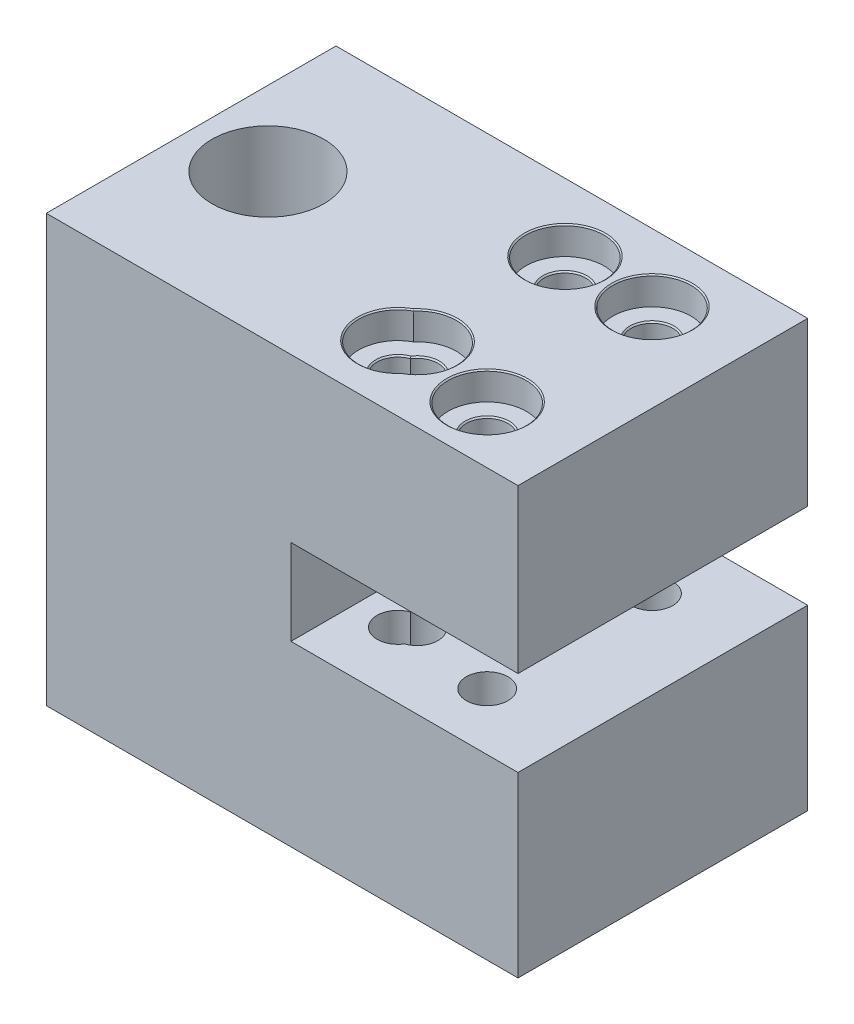
ISO-10303-21;
HEADER;
FILE_DESCRIPTION(('STEP AP214'),'2;1');
FILE_NAME('part.step','',(''),(''),'','','');
FILE_SCHEMA(('AUTOMOTIVE_DESIGN { 1 0 10303 214 1 1 1 1 }'));
ENDSEC;
DATA;
#1=APPLICATION_CONTEXT('core data for automotive mechanical design processes');
#2=APPLICATION_PROTOCOL_DEFINITION('international standard','automotive_design',2000,#1);
#3=PRODUCT_CONTEXT('',#1,'mechanical');
#4=PRODUCT('Part','Part','',(#3));
#5=PRODUCT_RELATED_PRODUCT_CATEGORY('part','',(#4));
#6=PRODUCT_DEFINITION_FORMATION('','',#4);
#7=PRODUCT_DEFINITION_CONTEXT('part definition',#1,'design');
#8=PRODUCT_DEFINITION('design','',#6,#7);
#9=PRODUCT_DEFINITION_SHAPE('','',#8);
#10=(LENGTH_UNIT() NAMED_UNIT(*) SI_UNIT(.MILLI.,.METRE.));
#11=(NAMED_UNIT(*) PLANE_ANGLE_UNIT() SI_UNIT($,.RADIAN.));
#12=(NAMED_UNIT(*) SI_UNIT($,.STERADIAN.) SOLID_ANGLE_UNIT());
#13=UNCERTAINTY_MEASURE_WITH_UNIT(LENGTH_MEASURE(1.E-05),#10,'distance_accuracy_value','');
#14=(GEOMETRIC_REPRESENTATION_CONTEXT(3) GLOBAL_UNCERTAINTY_ASSIGNED_CONTEXT((#13)) GLOBAL_UNIT_ASSIGNED_CONTEXT((#10,
#11,#12)) REPRESENTATION_CONTEXT('',''));
#15=CARTESIAN_POINT('',(0.,0.,0.));
#16=DIRECTION('',(0.,0.,1.));
#17=DIRECTION('',(1.,0.,0.));
#18=AXIS2_PLACEMENT_3D('',#15,#16,#17);
#19=CARTESIAN_POINT('',(27.3326379908102,88.3666,34.6915954341114));
#20=DIRECTION('',(0.,-1.,0.));
#21=DIRECTION('',(0.,0.,-1.));
#22=AXIS2_PLACEMENT_3D('',#19,#20,#21);
#23=PLANE('',#22);
#24=CARTESIAN_POINT('',(16.7763979908102,88.3666,34.6915954341114));
#25=DIRECTION('',(0.,1.,0.));
#26=DIRECTION('',(0.,0.,1.));
#27=AXIS2_PLACEMENT_3D('',#24,#25,#26);
#28=CIRCLE('',#27,18.65376);
#29=CARTESIAN_POINT('',(25.6803370064845,88.3666,51.0831369157034));
#30=VERTEX_POINT('',#29);
#31=CARTESIAN_POINT('',(2.75835526578295,88.3666,22.384798925803));
#32=VERTEX_POINT('',#31);
#33=EDGE_CURVE('E166',#30,#32,#28,.T.);
#34=ORIENTED_EDGE('',*,*,#33,.T.);
#35=CARTESIAN_POINT('',(11.6622942814573,88.3666,38.7763404073951));
#36=DIRECTION('',(0.,1.,0.));
#37=DIRECTION('',(0.,0.,1.));
#38=AXIS2_PLACEMENT_3D('',#35,#36,#37);
#39=CIRCLE('',#38,18.65376);
#40=EDGE_CURVE('E59',#32,#30,#39,.T.);
#41=ORIENTED_EDGE('',*,*,#40,.T.);
#42=EDGE_LOOP('',(#34,#41));
#43=FACE_BOUND('',#42,.T.);
#44=CARTESIAN_POINT('',(11.6622942814573,88.3666,38.7763404073951));
#45=DIRECTION('',(0.,1.,0.));
#46=DIRECTION('',(0.,0.,1.));
#47=AXIS2_PLACEMENT_3D('',#44,#45,#46);
#48=CIRCLE('',#47,10.55624);
#49=CARTESIAN_POINT('',(7.95592473799294,88.3666,28.8921597258778));
#50=VERTEX_POINT('',#49);
#51=CARTESIAN_POINT('',(20.4827675342745,88.3666,44.5757761156287));
#52=VERTEX_POINT('',#51);
#53=EDGE_CURVE('E11',#50,#52,#48,.T.);
#54=ORIENTED_EDGE('',*,*,#53,.F.);
#55=CARTESIAN_POINT('',(16.7763979908102,88.3666,34.6915954341114));
#56=DIRECTION('',(0.,1.,0.));
#57=DIRECTION('',(0.,0.,1.));
#58=AXIS2_PLACEMENT_3D('',#55,#56,#57);
#59=CIRCLE('',#58,10.55624);
#60=EDGE_CURVE('E161',#52,#50,#59,.T.);
#61=ORIENTED_EDGE('',*,*,#60,.F.);
#62=EDGE_LOOP('',(#54,#61));
#63=FACE_BOUND('',#62,.T.);
#64=ADVANCED_FACE('F35',(#43,#63),#23,.F.);
#65=CARTESIAN_POINT('',(100.175043425191,101.6,-68.0050091544998));
#66=DIRECTION('',(1.,0.,0.));
#67=DIRECTION('',(0.,0.,-1.));
#68=AXIS2_PLACEMENT_3D('',#65,#66,#67);
#69=PLANE('',#68);
#70=DIRECTION('',(0.,0.,1.));
#71=VECTOR('',#70,1.);
#72=CARTESIAN_POINT('',(100.175043425191,24.0369002652005,70.041087272898));
#73=LINE('',#72,#71);
#74=CARTESIAN_POINT('',(100.175043425191,24.0369002652005,-68.0050091544998));
#75=VERTEX_POINT('',#74);
#76=CARTESIAN_POINT('',(100.175043425191,24.0369002652005,70.041087272898));
#77=VERTEX_POINT('',#76);
#78=EDGE_CURVE('E185',#75,#77,#73,.T.);
#79=ORIENTED_EDGE('',*,*,#78,.F.);
#80=DIRECTION('',(0.,-1.,0.));
#81=VECTOR('',#80,1.);
#82=CARTESIAN_POINT('',(100.175043425191,101.6,-68.0050091544998));
#83=LINE('',#82,#81);
#84=CARTESIAN_POINT('',(100.175043425191,101.6,-68.0050091544998));
#85=VERTEX_POINT('',#84);
#86=EDGE_CURVE('E237',#85,#75,#83,.T.);
#87=ORIENTED_EDGE('',*,*,#86,.F.);
#88=DIRECTION('',(0.,0.,1.));
#89=VECTOR('',#88,1.);
#90=CARTESIAN_POINT('',(100.175043425191,101.6,-68.0050091544998));
#91=LINE('',#90,#89);
#92=CARTESIAN_POINT('',(100.175043425191,101.6,70.041087272898));
#93=VERTEX_POINT('',#92);
#94=EDGE_CURVE('E213',#85,#93,#91,.T.);
#95=ORIENTED_EDGE('',*,*,#94,.T.);
#96=DIRECTION('',(0.,-1.,0.));
#97=VECTOR('',#96,1.);
#98=CARTESIAN_POINT('',(100.175043425191,101.6,70.041087272898));
#99=LINE('',#98,#97);
#100=EDGE_CURVE('E44',#93,#77,#99,.T.);
#101=ORIENTED_EDGE('',*,*,#100,.T.);
#102=EDGE_LOOP('',(#79,#87,#95,#101));
#103=FACE_BOUND('',#102,.T.);
#104=ADVANCED_FACE('F420',(#103),#69,.T.);
#105=CARTESIAN_POINT('',(-124.60798084597,101.6,70.041087272898));
#106=DIRECTION('',(0.,0.,-1.));
#107=DIRECTION('',(-1.,0.,0.));
#108=AXIS2_PLACEMENT_3D('',#105,#106,#107);
#109=PLANE('',#108);
#110=DIRECTION('',(0.,-1.,0.));
#111=VECTOR('',#110,1.);
#112=CARTESIAN_POINT('',(-8.02895657480869,24.0369002652005,70.041087272898));
#113=LINE('',#112,#111);
#114=CARTESIAN_POINT('',(-8.02895657480869,24.0369002652005,70.041087272898));
#115=VERTEX_POINT('',#114);
#116=CARTESIAN_POINT('',(-8.02895657480869,-16.7804775436292,70.041087272898));
#117=VERTEX_POINT('',#116);
#118=EDGE_CURVE('E181',#115,#117,#113,.T.);
#119=ORIENTED_EDGE('',*,*,#118,.F.);
#120=DIRECTION('',(1.,0.,0.));
#121=VECTOR('',#120,1.);
#122=CARTESIAN_POINT('',(-8.02895657480869,24.0369002652005,70.041087272898));
#123=LINE('',#122,#121);
#124=EDGE_CURVE('E195',#115,#77,#123,.T.);
#125=ORIENTED_EDGE('',*,*,#124,.T.);
#126=ORIENTED_EDGE('',*,*,#100,.F.);
#127=DIRECTION('',(1.,0.,0.));
#128=VECTOR('',#127,1.);
#129=CARTESIAN_POINT('',(-124.60798084597,101.6,70.041087272898));
#130=LINE('',#129,#128);
#131=CARTESIAN_POINT('',(-124.60798084597,101.6,70.041087272898));
#132=VERTEX_POINT('',#131);
#133=EDGE_CURVE('E211',#132,#93,#130,.T.);
#134=ORIENTED_EDGE('',*,*,#133,.F.);
#135=DIRECTION('',(0.,-1.,0.));
#136=VECTOR('',#135,1.);
#137=CARTESIAN_POINT('',(-124.60798084597,101.6,70.041087272898));
#138=LINE('',#137,#136);
#139=CARTESIAN_POINT('',(-124.60798084597,-101.6,70.041087272898));
#140=VERTEX_POINT('',#139);
#141=EDGE_CURVE('E222',#132,#140,#138,.T.);
#142=ORIENTED_EDGE('',*,*,#141,.T.);
#143=DIRECTION('',(1.,0.,0.));
#144=VECTOR('',#143,1.);
#145=CARTESIAN_POINT('',(-124.60798084597,-101.6,70.041087272898));
#146=LINE('',#145,#144);
#147=CARTESIAN_POINT('',(100.175043425191,-101.6,70.041087272898));
#148=VERTEX_POINT('',#147);
#149=EDGE_CURVE('E208',#140,#148,#146,.T.);
#150=ORIENTED_EDGE('',*,*,#149,.T.);
#151=CARTESIAN_POINT('',(100.175043425191,-16.7804775436292,70.041087272898));
#152=VERTEX_POINT('',#151);
#153=EDGE_CURVE('E240',#152,#148,#99,.T.);
#154=ORIENTED_EDGE('',*,*,#153,.F.);
#155=DIRECTION('',(1.,0.,0.));
#156=VECTOR('',#155,1.);
#157=CARTESIAN_POINT('',(-8.02895657480869,-16.7804775436292,70.041087272898));
#158=LINE('',#157,#156);
#159=EDGE_CURVE('E192',#117,#152,#158,.T.);
#160=ORIENTED_EDGE('',*,*,#159,.F.);
#161=EDGE_LOOP('',(#119,#125,#126,#134,#142,#150,#154,#160));
#162=FACE_BOUND('',#161,.T.);
#163=ADVANCED_FACE('F37',(#162),#109,.F.);
#164=DIRECTION('',(0.,0.,-1.));
#165=VECTOR('',#164,1.);
#166=CARTESIAN_POINT('',(100.175043425191,-16.7804775436292,70.041087272898));
#167=LINE('',#166,#165);
#168=CARTESIAN_POINT('',(100.175043425191,-16.7804775436292,-68.0050091544998));
#169=VERTEX_POINT('',#168);
#170=EDGE_CURVE('E180',#152,#169,#167,.T.);
#171=ORIENTED_EDGE('',*,*,#170,.F.);
#172=ORIENTED_EDGE('',*,*,#153,.T.);
#173=DIRECTION('',(0.,0.,1.));
#174=VECTOR('',#173,1.);
#175=CARTESIAN_POINT('',(100.175043425191,-101.6,-68.0050091544998));
#176=LINE('',#175,#174);
#177=CARTESIAN_POINT('',(100.175043425191,-101.6,-68.0050091544998));
#178=VERTEX_POINT('',#177);
#179=EDGE_CURVE('E225',#178,#148,#176,.T.);
#180=ORIENTED_EDGE('',*,*,#179,.F.);
#181=EDGE_CURVE('E236',#169,#178,#83,.T.);
#182=ORIENTED_EDGE('',*,*,#181,.F.);
#183=EDGE_LOOP('',(#171,#172,#180,#182));
#184=FACE_BOUND('',#183,.T.);
#185=ADVANCED_FACE('F425',(#184),#69,.T.);
#186=CARTESIAN_POINT('',(-124.60798084597,101.6,-68.0050091544998));
#187=DIRECTION('',(0.,0.,-1.));
#188=DIRECTION('',(-1.,0.,0.));
#189=AXIS2_PLACEMENT_3D('',#186,#187,#188);
#190=PLANE('',#189);
#191=DIRECTION('',(1.,0.,0.));
#192=VECTOR('',#191,1.);
#193=CARTESIAN_POINT('',(-8.0289565748087,24.0369002652005,-68.0050091544998));
#194=LINE('',#193,#192);
#195=CARTESIAN_POINT('',(-8.0289565748087,24.0369002652005,-68.0050091544998));
#196=VERTEX_POINT('',#195);
#197=EDGE_CURVE('E199',#196,#75,#194,.T.);
#198=ORIENTED_EDGE('',*,*,#197,.F.);
#199=DIRECTION('',(0.,1.,0.));
#200=VECTOR('',#199,1.);
#201=CARTESIAN_POINT('',(-8.0289565748087,24.0369002652005,-68.0050091544998));
#202=LINE('',#201,#200);
#203=CARTESIAN_POINT('',(-8.0289565748087,-16.7804775436292,-68.0050091544998));
#204=VERTEX_POINT('',#203);
#205=EDGE_CURVE('E187',#204,#196,#202,.T.);
#206=ORIENTED_EDGE('',*,*,#205,.F.);
#207=DIRECTION('',(1.,0.,0.));
#208=VECTOR('',#207,1.);
#209=CARTESIAN_POINT('',(-8.0289565748087,-16.7804775436292,-68.0050091544998));
#210=LINE('',#209,#208);
#211=EDGE_CURVE('E201',#204,#169,#210,.T.);
#212=ORIENTED_EDGE('',*,*,#211,.T.);
#213=ORIENTED_EDGE('',*,*,#181,.T.);
#214=DIRECTION('',(1.,0.,0.));
#215=VECTOR('',#214,1.);
#216=CARTESIAN_POINT('',(-124.60798084597,-101.6,-68.0050091544998));
#217=LINE('',#216,#215);
#218=CARTESIAN_POINT('',(-124.60798084597,-101.6,-68.0050091544998));
#219=VERTEX_POINT('',#218);
#220=EDGE_CURVE('E228',#219,#178,#217,.T.);
#221=ORIENTED_EDGE('',*,*,#220,.F.);
#222=DIRECTION('',(0.,-1.,0.));
#223=VECTOR('',#222,1.);
#224=CARTESIAN_POINT('',(-124.60798084597,101.6,-68.0050091544998));
#225=LINE('',#224,#223);
#226=CARTESIAN_POINT('',(-124.60798084597,101.6,-68.0050091544998));
#227=VERTEX_POINT('',#226);
#228=EDGE_CURVE('E234',#227,#219,#225,.T.);
#229=ORIENTED_EDGE('',*,*,#228,.F.);
#230=DIRECTION('',(1.,0.,0.));
#231=VECTOR('',#230,1.);
#232=CARTESIAN_POINT('',(-124.60798084597,101.6,-68.0050091544998));
#233=LINE('',#232,#231);
#234=EDGE_CURVE('E217',#227,#85,#233,.T.);
#235=ORIENTED_EDGE('',*,*,#234,.T.);
#236=ORIENTED_EDGE('',*,*,#86,.T.);
#237=EDGE_LOOP('',(#198,#206,#212,#213,#221,#229,#235,#236));
#238=FACE_BOUND('',#237,.T.);
#239=ADVANCED_FACE('F478',(#238),#190,.T.);
#240=CARTESIAN_POINT('',(-124.60798084597,101.6,-68.0050091544998));
#241=DIRECTION('',(1.,0.,0.));
#242=DIRECTION('',(0.,0.,-1.));
#243=AXIS2_PLACEMENT_3D('',#240,#241,#242);
#244=PLANE('',#243);
#245=DIRECTION('',(0.,0.,1.));
#246=VECTOR('',#245,1.);
#247=CARTESIAN_POINT('',(-124.60798084597,-101.6,-68.0050091544998));
#248=LINE('',#247,#246);
#249=EDGE_CURVE('E214',#219,#140,#248,.T.);
#250=ORIENTED_EDGE('',*,*,#249,.T.);
#251=ORIENTED_EDGE('',*,*,#141,.F.);
#252=DIRECTION('',(0.,0.,1.));
#253=VECTOR('',#252,1.);
#254=CARTESIAN_POINT('',(-124.60798084597,101.6,-68.0050091544998));
#255=LINE('',#254,#253);
#256=EDGE_CURVE('E220',#227,#132,#255,.T.);
#257=ORIENTED_EDGE('',*,*,#256,.F.);
#258=ORIENTED_EDGE('',*,*,#228,.T.);
#259=EDGE_LOOP('',(#250,#251,#257,#258));
#260=FACE_BOUND('',#259,.T.);
#261=ADVANCED_FACE('F484',(#260),#244,.F.);
#262=CARTESIAN_POINT('',(0.,101.6,0.));
#263=DIRECTION('',(0.,-1.,0.));
#264=DIRECTION('',(0.,0.,-1.));
#265=AXIS2_PLACEMENT_3D('',#262,#263,#264);
#266=PLANE('',#265);
#267=CARTESIAN_POINT('',(58.2592708042995,101.6,42.8220550485889));
#268=DIRECTION('',(0.,1.,0.));
#269=DIRECTION('',(0.,0.,1.));
#270=AXIS2_PLACEMENT_3D('',#267,#268,#269);
#271=CIRCLE('',#270,19.28876);
#272=CARTESIAN_POINT('',(58.2592708042995,101.6,62.1108150485889));
#273=VERTEX_POINT('',#272);
#274=EDGE_CURVE('E832',#273,#273,#271,.T.);
#275=ORIENTED_EDGE('',*,*,#274,.F.);
#276=EDGE_LOOP('',(#275));
#277=FACE_BOUND('',#276,.T.);
#278=CARTESIAN_POINT('',(58.2592708042995,101.6,-35.7078035938514));
#279=DIRECTION('',(0.,1.,0.));
#280=DIRECTION('',(0.,0.,1.));
#281=AXIS2_PLACEMENT_3D('',#278,#279,#280);
#282=CIRCLE('',#281,19.28876);
#283=CARTESIAN_POINT('',(58.2592708042995,101.6,-16.4190435938514));
#284=VERTEX_POINT('',#283);
#285=EDGE_CURVE('E792',#284,#284,#282,.T.);
#286=ORIENTED_EDGE('',*,*,#285,.F.);
#287=EDGE_LOOP('',(#286));
#288=FACE_BOUND('',#287,.T.);
#289=CARTESIAN_POINT('',(16.7763979908102,101.6,-35.7078035938514));
#290=DIRECTION('',(0.,1.,0.));
#291=DIRECTION('',(0.,0.,1.));
#292=AXIS2_PLACEMENT_3D('',#289,#290,#291);
#293=CIRCLE('',#292,19.28876);
#294=CARTESIAN_POINT('',(16.7763979908102,101.6,-16.4190435938514));
#295=VERTEX_POINT('',#294);
#296=EDGE_CURVE('E256',#295,#295,#293,.T.);
#297=ORIENTED_EDGE('',*,*,#296,.F.);
#298=EDGE_LOOP('',(#297));
#299=FACE_BOUND('',#298,.T.);
#300=CARTESIAN_POINT('',(16.7763979908102,101.6,34.6915954341114));
#301=DIRECTION('',(0.,1.,0.));
#302=DIRECTION('',(0.,0.,1.));
#303=AXIS2_PLACEMENT_3D('',#300,#301,#302);
#304=CIRCLE('',#303,19.28876);
#305=CARTESIAN_POINT('',(26.0826644585667,101.6,51.5868511814717));
#306=VERTEX_POINT('',#305);
#307=CARTESIAN_POINT('',(2.35602781370075,101.6,21.8810846600348));
#308=VERTEX_POINT('',#307);
#309=EDGE_CURVE('E436',#306,#308,#304,.T.);
#310=ORIENTED_EDGE('',*,*,#309,.F.);
#311=CARTESIAN_POINT('',(11.6622942814573,101.6,38.7763404073951));
#312=DIRECTION('',(0.,1.,0.));
#313=DIRECTION('',(0.,0.,1.));
#314=AXIS2_PLACEMENT_3D('',#311,#312,#313);
#315=CIRCLE('',#314,19.28876);
#316=EDGE_CURVE('E286',#308,#306,#315,.T.);
#317=ORIENTED_EDGE('',*,*,#316,.F.);
#318=EDGE_LOOP('',(#310,#317));
#319=FACE_BOUND('',#318,.T.);
#320=CARTESIAN_POINT('',(-89.0235896754264,101.6,0.));
#321=DIRECTION('',(0.,1.,0.));
#322=DIRECTION('',(0.,0.,1.));
#323=AXIS2_PLACEMENT_3D('',#320,#321,#322);
#324=CIRCLE('',#323,26.6681934700859);
#325=CARTESIAN_POINT('',(-89.0235896754264,101.6,26.6681934700859));
#326=VERTEX_POINT('',#325);
#327=EDGE_CURVE('E198',#326,#326,#324,.T.);
#328=ORIENTED_EDGE('',*,*,#327,.F.);
#329=EDGE_LOOP('',(#328));
#330=FACE_BOUND('',#329,.T.);
#331=ORIENTED_EDGE('',*,*,#133,.T.);
#332=ORIENTED_EDGE('',*,*,#94,.F.);
#333=ORIENTED_EDGE('',*,*,#234,.F.);
#334=ORIENTED_EDGE('',*,*,#256,.T.);
#335=EDGE_LOOP('',(#331,#332,#333,#334));
#336=FACE_BOUND('',#335,.T.);
#337=ADVANCED_FACE('F476',(#277,#288,#299,#319,#330,#336),#266,.F.);
#338=CARTESIAN_POINT('',(0.,-101.6,0.));
#339=DIRECTION('',(0.,-1.,0.));
#340=DIRECTION('',(0.,0.,-1.));
#341=AXIS2_PLACEMENT_3D('',#338,#339,#340);
#342=PLANE('',#341);
#343=CARTESIAN_POINT('',(58.2592708042995,-101.6,42.8220550485889));
#344=DIRECTION('',(0.,1.,0.));
#345=DIRECTION('',(0.,0.,1.));
#346=AXIS2_PLACEMENT_3D('',#343,#344,#345);
#347=CIRCLE('',#346,9.92123999999994);
#348=CARTESIAN_POINT('',(58.2592708042995,-101.6,52.7432950485889));
#349=VERTEX_POINT('',#348);
#350=EDGE_CURVE('E787',#349,#349,#347,.T.);
#351=ORIENTED_EDGE('',*,*,#350,.T.);
#352=EDGE_LOOP('',(#351));
#353=FACE_BOUND('',#352,.T.);
#354=CARTESIAN_POINT('',(58.2592708042995,-101.6,-35.7078035938514));
#355=DIRECTION('',(0.,1.,0.));
#356=DIRECTION('',(0.,0.,1.));
#357=AXIS2_PLACEMENT_3D('',#354,#355,#356);
#358=CIRCLE('',#357,9.92123999999994);
#359=CARTESIAN_POINT('',(58.2592708042995,-101.6,-25.7865635938515));
#360=VERTEX_POINT('',#359);
#361=EDGE_CURVE('E252',#360,#360,#358,.T.);
#362=ORIENTED_EDGE('',*,*,#361,.T.);
#363=EDGE_LOOP('',(#362));
#364=FACE_BOUND('',#363,.T.);
#365=CARTESIAN_POINT('',(16.7763979908102,-101.6,-35.7078035938514));
#366=DIRECTION('',(0.,1.,0.));
#367=DIRECTION('',(0.,0.,1.));
#368=AXIS2_PLACEMENT_3D('',#365,#366,#367);
#369=CIRCLE('',#368,9.92123999999995);
#370=CARTESIAN_POINT('',(16.7763979908102,-101.6,-25.7865635938514));
#371=VERTEX_POINT('',#370);
#372=EDGE_CURVE('E248',#371,#371,#369,.T.);
#373=ORIENTED_EDGE('',*,*,#372,.T.);
#374=EDGE_LOOP('',(#373));
#375=FACE_BOUND('',#374,.T.);
#376=CARTESIAN_POINT('',(11.6622942814573,-101.6,38.7763404073951));
#377=DIRECTION('',(0.,1.,0.));
#378=DIRECTION('',(0.,0.,1.));
#379=AXIS2_PLACEMENT_3D('',#376,#377,#378);
#380=CIRCLE('',#379,9.92123999999995);
#381=CARTESIAN_POINT('',(8.37418388672209,-101.6,29.4158204875598));
#382=VERTEX_POINT('',#381);
#383=CARTESIAN_POINT('',(20.0645083855454,-101.6,44.0521153539467));
#384=VERTEX_POINT('',#383);
#385=EDGE_CURVE('E52',#382,#384,#380,.T.);
#386=ORIENTED_EDGE('',*,*,#385,.T.);
#387=CARTESIAN_POINT('',(16.7763979908102,-101.6,34.6915954341114));
#388=DIRECTION('',(0.,1.,0.));
#389=DIRECTION('',(0.,0.,1.));
#390=AXIS2_PLACEMENT_3D('',#387,#388,#389);
#391=CIRCLE('',#390,9.92123999999995);
#392=EDGE_CURVE('E168',#384,#382,#391,.T.);
#393=ORIENTED_EDGE('',*,*,#392,.T.);
#394=EDGE_LOOP('',(#386,#393));
#395=FACE_BOUND('',#394,.T.);
#396=ORIENTED_EDGE('',*,*,#149,.F.);
#397=ORIENTED_EDGE('',*,*,#249,.F.);
#398=ORIENTED_EDGE('',*,*,#220,.T.);
#399=ORIENTED_EDGE('',*,*,#179,.T.);
#400=EDGE_LOOP('',(#396,#397,#398,#399));
#401=FACE_BOUND('',#400,.T.);
#402=ADVANCED_FACE('F488',(#353,#364,#375,#395,#401),#342,.T.);
#403=CARTESIAN_POINT('',(-89.0235896754264,-6.60399999999998,0.));
#404=DIRECTION('',(0.,1.,0.));
#405=DIRECTION('',(0.,0.,1.));
#406=AXIS2_PLACEMENT_3D('',#403,#404,#405);
#407=CYLINDRICAL_SURFACE('',#406,26.6681934700859);
#408=CARTESIAN_POINT('',(-89.0235896754264,-6.60399999999998,0.));
#409=DIRECTION('',(0.,1.,0.));
#410=DIRECTION('',(0.,0.,1.));
#411=AXIS2_PLACEMENT_3D('',#408,#409,#410);
#412=CIRCLE('',#411,26.6681934700859);
#413=CARTESIAN_POINT('',(-89.0235896754264,-6.60399999999998,26.6681934700859));
#414=VERTEX_POINT('',#413);
#415=EDGE_CURVE('E205',#414,#414,#412,.T.);
#416=ORIENTED_EDGE('',*,*,#415,.F.);
#417=EDGE_LOOP('',(#416));
#418=FACE_BOUND('',#417,.T.);
#419=ORIENTED_EDGE('',*,*,#327,.T.);
#420=EDGE_LOOP('',(#419));
#421=FACE_BOUND('',#420,.T.);
#422=ADVANCED_FACE('F511',(#418,#421),#407,.F.);
#423=CARTESIAN_POINT('',(-89.0235896754264,-6.60399999999998,0.));
#424=DIRECTION('',(0.,1.,0.));
#425=DIRECTION('',(0.,0.,1.));
#426=AXIS2_PLACEMENT_3D('',#423,#424,#425);
#427=PLANE('',#426);
#428=ORIENTED_EDGE('',*,*,#415,.T.);
#429=EDGE_LOOP('',(#428));
#430=FACE_BOUND('',#429,.T.);
#431=ADVANCED_FACE('F462',(#430),#427,.T.);
#432=CARTESIAN_POINT('',(-8.02895657480869,24.0369002652005,70.041087272898));
#433=DIRECTION('',(0.,1.,0.));
#434=DIRECTION('',(0.,0.,1.));
#435=AXIS2_PLACEMENT_3D('',#432,#433,#434);
#436=PLANE('',#435);
#437=CARTESIAN_POINT('',(58.2592708042995,24.0369002652005,42.8220550485889));
#438=DIRECTION('',(0.,1.,0.));
#439=DIRECTION('',(0.,0.,1.));
#440=AXIS2_PLACEMENT_3D('',#437,#438,#439);
#441=CIRCLE('',#440,9.92123999999998);
#442=CARTESIAN_POINT('',(58.2592708042995,24.0369002652005,52.7432950485889));
#443=VERTEX_POINT('',#442);
#444=EDGE_CURVE('E790',#443,#443,#441,.T.);
#445=ORIENTED_EDGE('',*,*,#444,.T.);
#446=EDGE_LOOP('',(#445));
#447=FACE_BOUND('',#446,.T.);
#448=CARTESIAN_POINT('',(58.2592708042995,24.0369002652005,-35.7078035938514));
#449=DIRECTION('',(0.,1.,0.));
#450=DIRECTION('',(0.,0.,1.));
#451=AXIS2_PLACEMENT_3D('',#448,#449,#450);
#452=CIRCLE('',#451,9.92123999999998);
#453=CARTESIAN_POINT('',(58.2592708042995,24.0369002652005,-25.7865635938514));
#454=VERTEX_POINT('',#453);
#455=EDGE_CURVE('E251',#454,#454,#452,.T.);
#456=ORIENTED_EDGE('',*,*,#455,.T.);
#457=EDGE_LOOP('',(#456));
#458=FACE_BOUND('',#457,.T.);
#459=CARTESIAN_POINT('',(16.7763979908102,24.0369002652005,-35.7078035938514));
#460=DIRECTION('',(0.,1.,0.));
#461=DIRECTION('',(0.,0.,1.));
#462=AXIS2_PLACEMENT_3D('',#459,#460,#461);
#463=CIRCLE('',#462,9.92123999999998);
#464=CARTESIAN_POINT('',(16.7763979908102,24.0369002652005,-25.7865635938514));
#465=VERTEX_POINT('',#464);
#466=EDGE_CURVE('E247',#465,#465,#463,.T.);
#467=ORIENTED_EDGE('',*,*,#466,.T.);
#468=EDGE_LOOP('',(#467));
#469=FACE_BOUND('',#468,.T.);
#470=CARTESIAN_POINT('',(16.7763979908102,24.0369002652005,34.6915954341114));
#471=DIRECTION('',(0.,1.,0.));
#472=DIRECTION('',(0.,0.,1.));
#473=AXIS2_PLACEMENT_3D('',#470,#471,#472);
#474=CIRCLE('',#473,9.92123999999998);
#475=CARTESIAN_POINT('',(20.0645083855454,24.0369002652005,44.0521153539467));
#476=VERTEX_POINT('',#475);
#477=CARTESIAN_POINT('',(8.37418388672206,24.0369002652005,29.4158204875597));
#478=VERTEX_POINT('',#477);
#479=EDGE_CURVE('E177',#476,#478,#474,.T.);
#480=ORIENTED_EDGE('',*,*,#479,.T.);
#481=CARTESIAN_POINT('',(11.6622942814573,24.0369002652005,38.7763404073951));
#482=DIRECTION('',(0.,1.,0.));
#483=DIRECTION('',(0.,0.,1.));
#484=AXIS2_PLACEMENT_3D('',#481,#482,#483);
#485=CIRCLE('',#484,9.92123999999998);
#486=EDGE_CURVE('E450',#478,#476,#485,.T.);
#487=ORIENTED_EDGE('',*,*,#486,.T.);
#488=EDGE_LOOP('',(#480,#487));
#489=FACE_BOUND('',#488,.T.);
#490=ORIENTED_EDGE('',*,*,#78,.T.);
#491=ORIENTED_EDGE('',*,*,#124,.F.);
#492=DIRECTION('',(0.,0.,1.));
#493=VECTOR('',#492,1.);
#494=CARTESIAN_POINT('',(-8.02895657480869,24.0369002652005,70.041087272898));
#495=LINE('',#494,#493);
#496=EDGE_CURVE('E189',#196,#115,#495,.T.);
#497=ORIENTED_EDGE('',*,*,#496,.F.);
#498=ORIENTED_EDGE('',*,*,#197,.T.);
#499=EDGE_LOOP('',(#490,#491,#497,#498));
#500=FACE_BOUND('',#499,.T.);
#501=ADVANCED_FACE('F458',(#447,#458,#469,#489,#500),#436,.F.);
#502=CARTESIAN_POINT('',(-8.02895657480869,-16.7804775436292,70.041087272898));
#503=DIRECTION('',(0.,-1.,0.));
#504=DIRECTION('',(0.,0.,-1.));
#505=AXIS2_PLACEMENT_3D('',#502,#503,#504);
#506=PLANE('',#505);
#507=CARTESIAN_POINT('',(58.2592708042995,-16.7804775436292,42.8220550485889));
#508=DIRECTION('',(0.,-1.,0.));
#509=DIRECTION('',(0.,0.,-1.));
#510=AXIS2_PLACEMENT_3D('',#507,#508,#509);
#511=CIRCLE('',#510,9.92123999999998);
#512=CARTESIAN_POINT('',(58.2592708042995,-16.7804775436292,32.900815048589));
#513=VERTEX_POINT('',#512);
#514=EDGE_CURVE('E39',#513,#513,#511,.T.);
#515=ORIENTED_EDGE('',*,*,#514,.T.);
#516=EDGE_LOOP('',(#515));
#517=FACE_BOUND('',#516,.T.);
#518=CARTESIAN_POINT('',(58.2592708042995,-16.7804775436292,-35.7078035938514));
#519=DIRECTION('',(0.,-1.,0.));
#520=DIRECTION('',(0.,0.,-1.));
#521=AXIS2_PLACEMENT_3D('',#518,#519,#520);
#522=CIRCLE('',#521,9.92123999999998);
#523=CARTESIAN_POINT('',(58.2592708042995,-16.7804775436292,-45.6290435938514));
#524=VERTEX_POINT('',#523);
#525=EDGE_CURVE('E249',#524,#524,#522,.T.);
#526=ORIENTED_EDGE('',*,*,#525,.T.);
#527=EDGE_LOOP('',(#526));
#528=FACE_BOUND('',#527,.T.);
#529=CARTESIAN_POINT('',(16.7763979908102,-16.7804775436292,-35.7078035938514));
#530=DIRECTION('',(0.,-1.,0.));
#531=DIRECTION('',(0.,0.,-1.));
#532=AXIS2_PLACEMENT_3D('',#529,#530,#531);
#533=CIRCLE('',#532,9.92123999999998);
#534=CARTESIAN_POINT('',(16.7763979908102,-16.7804775436292,-45.6290435938514));
#535=VERTEX_POINT('',#534);
#536=EDGE_CURVE('E245',#535,#535,#533,.T.);
#537=ORIENTED_EDGE('',*,*,#536,.T.);
#538=EDGE_LOOP('',(#537));
#539=FACE_BOUND('',#538,.T.);
#540=CARTESIAN_POINT('',(16.7763979908102,-16.7804775436292,34.6915954341114));
#541=DIRECTION('',(0.,-1.,0.));
#542=DIRECTION('',(0.,0.,-1.));
#543=AXIS2_PLACEMENT_3D('',#540,#541,#542);
#544=CIRCLE('',#543,9.92123999999998);
#545=CARTESIAN_POINT('',(8.37418388672206,-16.7804775436292,29.4158204875597));
#546=VERTEX_POINT('',#545);
#547=CARTESIAN_POINT('',(20.0645083855454,-16.7804775436292,44.0521153539467));
#548=VERTEX_POINT('',#547);
#549=EDGE_CURVE('E176',#546,#548,#544,.T.);
#550=ORIENTED_EDGE('',*,*,#549,.T.);
#551=CARTESIAN_POINT('',(11.6622942814573,-16.7804775436292,38.7763404073951));
#552=DIRECTION('',(0.,-1.,0.));
#553=DIRECTION('',(0.,0.,-1.));
#554=AXIS2_PLACEMENT_3D('',#551,#552,#553);
#555=CIRCLE('',#554,9.92123999999998);
#556=EDGE_CURVE('E441',#548,#546,#555,.T.);
#557=ORIENTED_EDGE('',*,*,#556,.T.);
#558=EDGE_LOOP('',(#550,#557));
#559=FACE_BOUND('',#558,.T.);
#560=ORIENTED_EDGE('',*,*,#170,.T.);
#561=ORIENTED_EDGE('',*,*,#211,.F.);
#562=DIRECTION('',(0.,0.,-1.));
#563=VECTOR('',#562,1.);
#564=CARTESIAN_POINT('',(-8.02895657480869,-16.7804775436292,70.041087272898));
#565=LINE('',#564,#563);
#566=EDGE_CURVE('E184',#117,#204,#565,.T.);
#567=ORIENTED_EDGE('',*,*,#566,.F.);
#568=ORIENTED_EDGE('',*,*,#159,.T.);
#569=EDGE_LOOP('',(#560,#561,#567,#568));
#570=FACE_BOUND('',#569,.T.);
#571=ADVANCED_FACE('F461',(#517,#528,#539,#559,#570),#506,.F.);
#572=CARTESIAN_POINT('',(-8.0289565748087,0.,0.));
#573=DIRECTION('',(1.,0.,0.));
#574=DIRECTION('',(0.,0.,-1.));
#575=AXIS2_PLACEMENT_3D('',#572,#573,#574);
#576=PLANE('',#575);
#577=ORIENTED_EDGE('',*,*,#118,.T.);
#578=ORIENTED_EDGE('',*,*,#566,.T.);
#579=ORIENTED_EDGE('',*,*,#205,.T.);
#580=ORIENTED_EDGE('',*,*,#496,.T.);
#581=EDGE_LOOP('',(#577,#578,#579,#580));
#582=FACE_BOUND('',#581,.T.);
#583=ADVANCED_FACE('F497',(#582),#576,.T.);
#584=CARTESIAN_POINT('',(16.7763979908102,101.6,34.6915954341114));
#585=DIRECTION('',(0.,1.,0.));
#586=DIRECTION('',(0.,0.,1.));
#587=AXIS2_PLACEMENT_3D('',#584,#585,#586);
#588=CYLINDRICAL_SURFACE('',#587,9.92123999999998);
#589=ORIENTED_EDGE('',*,*,#392,.F.);
#590=DIRECTION('',(0.,1.,0.));
#591=VECTOR('',#590,1.);
#592=CARTESIAN_POINT('',(20.0645083855454,-6.9342,44.0521153539467));
#593=LINE('',#592,#591);
#594=EDGE_CURVE('E438',#384,#548,#593,.T.);
#595=ORIENTED_EDGE('',*,*,#594,.T.);
#596=ORIENTED_EDGE('',*,*,#549,.F.);
#597=DIRECTION('',(0.,1.,0.));
#598=VECTOR('',#597,1.);
#599=CARTESIAN_POINT('',(8.37418388672206,-6.9342,29.4158204875598));
#600=LINE('',#599,#598);
#601=EDGE_CURVE('E446',#546,#382,#600,.F.);
#602=ORIENTED_EDGE('',*,*,#601,.T.);
#603=EDGE_LOOP('',(#589,#595,#596,#602));
#604=FACE_BOUND('',#603,.T.);
#605=ADVANCED_FACE('F499',(#604),#588,.F.);
#606=ORIENTED_EDGE('',*,*,#479,.F.);
#607=DIRECTION('',(0.,1.,0.));
#608=VECTOR('',#607,1.);
#609=CARTESIAN_POINT('',(20.0645083855454,-6.9342,44.0521153539467));
#610=LINE('',#609,#608);
#611=CARTESIAN_POINT('',(20.0645083855454,87.7316,44.0521153539468));
#612=VERTEX_POINT('',#611);
#613=EDGE_CURVE('E448',#476,#612,#610,.T.);
#614=ORIENTED_EDGE('',*,*,#613,.T.);
#615=CARTESIAN_POINT('',(16.7763979908102,87.7316,34.6915954341114));
#616=DIRECTION('',(0.,1.,0.));
#617=DIRECTION('',(0.,0.,1.));
#618=AXIS2_PLACEMENT_3D('',#615,#616,#617);
#619=CIRCLE('',#618,9.92124000000002);
#620=CARTESIAN_POINT('',(8.37418388672199,87.7316,29.4158204875597));
#621=VERTEX_POINT('',#620);
#622=EDGE_CURVE('E163',#612,#621,#619,.T.);
#623=ORIENTED_EDGE('',*,*,#622,.T.);
#624=DIRECTION('',(0.,1.,0.));
#625=VECTOR('',#624,1.);
#626=CARTESIAN_POINT('',(8.37418388672206,-6.9342,29.4158204875598));
#627=LINE('',#626,#625);
#628=EDGE_CURVE('E347',#621,#478,#627,.F.);
#629=ORIENTED_EDGE('',*,*,#628,.T.);
#630=EDGE_LOOP('',(#606,#614,#623,#629));
#631=FACE_BOUND('',#630,.T.);
#632=ADVANCED_FACE('F456',(#631),#588,.F.);
#633=CARTESIAN_POINT('',(16.7763979908102,88.3666,34.6915954341114));
#634=DIRECTION('',(0.,1.,0.));
#635=DIRECTION('',(0.,0.,1.));
#636=AXIS2_PLACEMENT_3D('',#633,#634,#635);
#637=CONICAL_SURFACE('',#636,10.55624,0.785398163397432);
#638=ORIENTED_EDGE('',*,*,#60,.T.);
#639=CARTESIAN_POINT('',(7.95579345280149,88.3668,28.8919953567216));
#640=CARTESIAN_POINT('',(8.02543058316377,88.2607027409851,28.9791810951272));
#641=CARTESIAN_POINT('',(8.09512603510728,88.1547041127548,29.0664398521954));
#642=CARTESIAN_POINT('',(8.23463358552782,87.9429041127453,29.2411034078775));
#643=CARTESIAN_POINT('',(8.30444568401049,87.8371027409756,29.3285082064985));
#644=CARTESIAN_POINT('',(8.37431610408002,87.7314,29.4159860237891));
#645=B_SPLINE_CURVE_WITH_KNOTS('',3,(#639,#640,#641,#642,#643,#644),.UNSPECIFIED.,.F.,.F.,(4,2,
4),(0.,0.461914822278599,0.923829666880794),.UNSPECIFIED.);
#646=EDGE_CURVE('E154',#50,#621,#645,.T.);
#647=ORIENTED_EDGE('',*,*,#646,.T.);
#648=ORIENTED_EDGE('',*,*,#622,.F.);
#649=CARTESIAN_POINT('',(20.0643761681875,87.7314,44.0519498177173));
#650=CARTESIAN_POINT('',(20.134246588257,87.8371027409756,44.1394276350079));
#651=CARTESIAN_POINT('',(20.2040586867397,87.9429041127453,44.2268324336289));
#652=CARTESIAN_POINT('',(20.3435662371602,88.1547041127548,44.4014959893111));
#653=CARTESIAN_POINT('',(20.4132616891037,88.2607027409851,44.4887547463793));
#654=CARTESIAN_POINT('',(20.482898819466,88.3668,44.5759404847849));
#655=B_SPLINE_CURVE_WITH_KNOTS('',3,(#649,#650,#651,#652,#653,#654),.UNSPECIFIED.,.F.,.F.,(4,2,
4),(0.,0.461914844602195,0.923829666880791),.UNSPECIFIED.);
#656=EDGE_CURVE('E151',#612,#52,#655,.T.);
#657=ORIENTED_EDGE('',*,*,#656,.T.);
#658=EDGE_LOOP('',(#638,#647,#648,#657));
#659=FACE_BOUND('',#658,.T.);
#660=ADVANCED_FACE('F160',(#659),#637,.F.);
#661=CARTESIAN_POINT('',(16.7763979908102,101.6,34.6915954341114));
#662=DIRECTION('',(0.,1.,0.));
#663=DIRECTION('',(0.,0.,1.));
#664=AXIS2_PLACEMENT_3D('',#661,#662,#663);
#665=CYLINDRICAL_SURFACE('',#664,18.65376);
#666=ORIENTED_EDGE('',*,*,#33,.F.);
#667=DIRECTION('',(0.,1.,0.));
#668=VECTOR('',#667,1.);
#669=CARTESIAN_POINT('',(25.6803370064845,94.7168858671012,51.0831369157034));
#670=LINE('',#669,#668);
#671=CARTESIAN_POINT('',(25.6803370064845,101.067171734202,51.0831369157034));
#672=VERTEX_POINT('',#671);
#673=EDGE_CURVE('E164',#30,#672,#670,.T.);
#674=ORIENTED_EDGE('',*,*,#673,.T.);
#675=CARTESIAN_POINT('',(16.7763979908102,101.067171734202,34.6915954341114));
#676=DIRECTION('',(0.,1.,0.));
#677=DIRECTION('',(0.,0.,1.));
#678=AXIS2_PLACEMENT_3D('',#675,#676,#677);
#679=CIRCLE('',#678,18.65376);
#680=CARTESIAN_POINT('',(2.75835526578295,101.067171734202,22.384798925803));
#681=VERTEX_POINT('',#680);
#682=EDGE_CURVE('E170',#672,#681,#679,.T.);
#683=ORIENTED_EDGE('',*,*,#682,.T.);
#684=DIRECTION('',(0.,1.,0.));
#685=VECTOR('',#684,1.);
#686=CARTESIAN_POINT('',(2.75835526578294,94.7168858671012,22.384798925803));
#687=LINE('',#686,#685);
#688=EDGE_CURVE('E295',#681,#32,#687,.F.);
#689=ORIENTED_EDGE('',*,*,#688,.T.);
#690=EDGE_LOOP('',(#666,#674,#683,#689));
#691=FACE_BOUND('',#690,.T.);
#692=ADVANCED_FACE('F331',(#691),#665,.F.);
#693=CARTESIAN_POINT('',(16.7763979908102,101.6,34.6915954341114));
#694=DIRECTION('',(0.,1.,0.));
#695=DIRECTION('',(0.,0.,1.));
#696=AXIS2_PLACEMENT_3D('',#693,#694,#695);
#697=CONICAL_SURFACE('',#696,19.28876,0.872664625997158);
#698=ORIENTED_EDGE('',*,*,#309,.T.);
#699=CARTESIAN_POINT('',(2.35587687414363,101.6002,21.8808956835983));
#700=CARTESIAN_POINT('',(2.42296779420209,101.511301492026,21.9648935648318));
#701=CARTESIAN_POINT('',(2.49006571142025,101.422416549234,22.0489002065143));
#702=CARTESIAN_POINT('',(2.62427554021171,101.244673793968,22.2169310108224));
#703=CARTESIAN_POINT('',(2.69138745178502,101.155815981494,22.3009551734479));
#704=CARTESIAN_POINT('',(2.75850636051803,101.066971734202,22.3849880965225));
#705=B_SPLINE_CURVE_WITH_KNOTS('',3,(#699,#700,#701,#702,#703,#704),.UNSPECIFIED.,.F.,.F.,(4,2,
4),(0.,0.418494939720818,0.836989879664749),.UNSPECIFIED.);
#706=EDGE_CURVE('E340',#308,#681,#705,.T.);
#707=ORIENTED_EDGE('',*,*,#706,.T.);
#708=ORIENTED_EDGE('',*,*,#682,.F.);
#709=CARTESIAN_POINT('',(25.6801859117494,101.066971734202,51.082947744984));
#710=CARTESIAN_POINT('',(25.7473048204824,101.155815981494,51.1669806680586));
#711=CARTESIAN_POINT('',(25.8144167320557,101.244673793968,51.2510048306841));
#712=CARTESIAN_POINT('',(25.9486265608472,101.422416549234,51.4190356349921));
#713=CARTESIAN_POINT('',(26.0157244780654,101.511301492026,51.5030422766747));
#714=CARTESIAN_POINT('',(26.0828153981238,101.6002,51.5870401579081));
#715=B_SPLINE_CURVE_WITH_KNOTS('',3,(#709,#710,#711,#712,#713,#714),.UNSPECIFIED.,.F.,.F.,(4,2,
4),(0.,0.41849493994393,0.836989879664748),.UNSPECIFIED.);
#716=EDGE_CURVE('E334',#672,#306,#715,.T.);
#717=ORIENTED_EDGE('',*,*,#716,.T.);
#718=EDGE_LOOP('',(#698,#707,#708,#717));
#719=FACE_BOUND('',#718,.T.);
#720=ADVANCED_FACE('F319',(#719),#697,.F.);
#721=CARTESIAN_POINT('',(11.6622942814573,88.3666,38.7763404073951));
#722=DIRECTION('',(0.,1.,0.));
#723=DIRECTION('',(0.,0.,1.));
#724=AXIS2_PLACEMENT_3D('',#721,#722,#723);
#725=CONICAL_SURFACE('',#724,10.55624,0.785398163397432);
#726=ORIENTED_EDGE('',*,*,#53,.T.);
#727=ORIENTED_EDGE('',*,*,#656,.F.);
#728=CARTESIAN_POINT('',(11.6622942814573,87.7316,38.7763404073951));
#729=DIRECTION('',(0.,1.,0.));
#730=DIRECTION('',(0.,0.,1.));
#731=AXIS2_PLACEMENT_3D('',#728,#729,#730);
#732=CIRCLE('',#731,9.92124000000002);
#733=EDGE_CURVE('E291',#621,#612,#732,.T.);
#734=ORIENTED_EDGE('',*,*,#733,.F.);
#735=ORIENTED_EDGE('',*,*,#646,.F.);
#736=EDGE_LOOP('',(#726,#727,#734,#735));
#737=FACE_BOUND('',#736,.T.);
#738=ADVANCED_FACE('F149',(#737),#725,.F.);
#739=CARTESIAN_POINT('',(11.6622942814573,101.6,38.7763404073951));
#740=DIRECTION('',(0.,1.,0.));
#741=DIRECTION('',(0.,0.,1.));
#742=AXIS2_PLACEMENT_3D('',#739,#740,#741);
#743=CYLINDRICAL_SURFACE('',#742,9.92123999999998);
#744=ORIENTED_EDGE('',*,*,#486,.F.);
#745=ORIENTED_EDGE('',*,*,#628,.F.);
#746=ORIENTED_EDGE('',*,*,#733,.T.);
#747=ORIENTED_EDGE('',*,*,#613,.F.);
#748=EDGE_LOOP('',(#744,#745,#746,#747));
#749=FACE_BOUND('',#748,.T.);
#750=ADVANCED_FACE('F318',(#749),#743,.F.);
#751=CARTESIAN_POINT('',(11.6622942814573,101.6,38.7763404073951));
#752=DIRECTION('',(0.,1.,0.));
#753=DIRECTION('',(0.,0.,1.));
#754=AXIS2_PLACEMENT_3D('',#751,#752,#753);
#755=CYLINDRICAL_SURFACE('',#754,18.65376);
#756=ORIENTED_EDGE('',*,*,#40,.F.);
#757=ORIENTED_EDGE('',*,*,#688,.F.);
#758=CARTESIAN_POINT('',(11.6622942814573,101.067171734202,38.7763404073951));
#759=DIRECTION('',(0.,1.,0.));
#760=DIRECTION('',(0.,0.,1.));
#761=AXIS2_PLACEMENT_3D('',#758,#759,#760);
#762=CIRCLE('',#761,18.65376);
#763=EDGE_CURVE('E288',#681,#672,#762,.T.);
#764=ORIENTED_EDGE('',*,*,#763,.T.);
#765=ORIENTED_EDGE('',*,*,#673,.F.);
#766=EDGE_LOOP('',(#756,#757,#764,#765));
#767=FACE_BOUND('',#766,.T.);
#768=ADVANCED_FACE('F320',(#767),#755,.F.);
#769=CARTESIAN_POINT('',(11.6622942814573,101.6,38.7763404073951));
#770=DIRECTION('',(0.,1.,0.));
#771=DIRECTION('',(0.,0.,1.));
#772=AXIS2_PLACEMENT_3D('',#769,#770,#771);
#773=CONICAL_SURFACE('',#772,19.28876,0.872664625997158);
#774=ORIENTED_EDGE('',*,*,#316,.T.);
#775=ORIENTED_EDGE('',*,*,#716,.F.);
#776=ORIENTED_EDGE('',*,*,#763,.F.);
#777=ORIENTED_EDGE('',*,*,#706,.F.);
#778=EDGE_LOOP('',(#774,#775,#776,#777));
#779=FACE_BOUND('',#778,.T.);
#780=ADVANCED_FACE('F327',(#779),#773,.F.);
#781=ORIENTED_EDGE('',*,*,#385,.F.);
#782=ORIENTED_EDGE('',*,*,#601,.F.);
#783=ORIENTED_EDGE('',*,*,#556,.F.);
#784=ORIENTED_EDGE('',*,*,#594,.F.);
#785=EDGE_LOOP('',(#781,#782,#783,#784));
#786=FACE_BOUND('',#785,.T.);
#787=ADVANCED_FACE('F322',(#786),#743,.F.);
#788=CARTESIAN_POINT('',(16.7763979908102,101.6,-35.7078035938514));
#789=DIRECTION('',(0.,1.,0.));
#790=DIRECTION('',(0.,0.,1.));
#791=AXIS2_PLACEMENT_3D('',#788,#789,#790);
#792=CYLINDRICAL_SURFACE('',#791,9.92123999999998);
#793=ORIENTED_EDGE('',*,*,#372,.F.);
#794=EDGE_LOOP('',(#793));
#795=FACE_BOUND('',#794,.T.);
#796=ORIENTED_EDGE('',*,*,#536,.F.);
#797=EDGE_LOOP('',(#796));
#798=FACE_BOUND('',#797,.T.);
#799=ADVANCED_FACE('F326',(#795,#798),#792,.F.);
#800=CARTESIAN_POINT('',(16.7763979908102,87.7316,-35.7078035938514));
#801=DIRECTION('',(0.,1.,0.));
#802=DIRECTION('',(0.,0.,1.));
#803=AXIS2_PLACEMENT_3D('',#800,#801,#802);
#804=CIRCLE('',#803,9.92124000000002);
#805=CARTESIAN_POINT('',(16.7763979908102,87.7316,-25.7865635938514));
#806=VERTEX_POINT('',#805);
#807=EDGE_CURVE('E279',#806,#806,#804,.T.);
#808=ORIENTED_EDGE('',*,*,#807,.T.);
#809=EDGE_LOOP('',(#808));
#810=FACE_BOUND('',#809,.T.);
#811=ORIENTED_EDGE('',*,*,#466,.F.);
#812=EDGE_LOOP('',(#811));
#813=FACE_BOUND('',#812,.T.);
#814=ADVANCED_FACE('F353',(#810,#813),#792,.F.);
#815=CARTESIAN_POINT('',(16.7763979908102,88.3666,-35.7078035938514));
#816=DIRECTION('',(0.,1.,0.));
#817=DIRECTION('',(0.,0.,1.));
#818=AXIS2_PLACEMENT_3D('',#815,#816,#817);
#819=CONICAL_SURFACE('',#818,10.55624,0.785398163397432);
#820=ORIENTED_EDGE('',*,*,#807,.F.);
#821=EDGE_LOOP('',(#820));
#822=FACE_BOUND('',#821,.T.);
#823=CARTESIAN_POINT('',(16.7763979908102,88.3666,-35.7078035938514));
#824=DIRECTION('',(0.,1.,0.));
#825=DIRECTION('',(0.,0.,1.));
#826=AXIS2_PLACEMENT_3D('',#823,#824,#825);
#827=CIRCLE('',#826,10.55624);
#828=CARTESIAN_POINT('',(16.7763979908102,88.3666,-25.1515635938514));
#829=VERTEX_POINT('',#828);
#830=EDGE_CURVE('E276',#829,#829,#827,.T.);
#831=ORIENTED_EDGE('',*,*,#830,.T.);
#832=EDGE_LOOP('',(#831));
#833=FACE_BOUND('',#832,.T.);
#834=ADVANCED_FACE('F357',(#822,#833),#819,.F.);
#835=CARTESIAN_POINT('',(27.3326379908102,88.3666,-35.7078035938514));
#836=DIRECTION('',(0.,-1.,0.));
#837=DIRECTION('',(0.,0.,-1.));
#838=AXIS2_PLACEMENT_3D('',#835,#836,#837);
#839=PLANE('',#838);
#840=ORIENTED_EDGE('',*,*,#830,.F.);
#841=EDGE_LOOP('',(#840));
#842=FACE_BOUND('',#841,.T.);
#843=CARTESIAN_POINT('',(16.7763979908102,88.3666,-35.7078035938514));
#844=DIRECTION('',(0.,1.,0.));
#845=DIRECTION('',(0.,0.,1.));
#846=AXIS2_PLACEMENT_3D('',#843,#844,#845);
#847=CIRCLE('',#846,18.65376);
#848=CARTESIAN_POINT('',(16.7763979908102,88.3666,-17.0540435938514));
#849=VERTEX_POINT('',#848);
#850=EDGE_CURVE('E273',#849,#849,#847,.T.);
#851=ORIENTED_EDGE('',*,*,#850,.T.);
#852=EDGE_LOOP('',(#851));
#853=FACE_BOUND('',#852,.T.);
#854=ADVANCED_FACE('F361',(#842,#853),#839,.F.);
#855=CARTESIAN_POINT('',(16.7763979908102,101.6,-35.7078035938514));
#856=DIRECTION('',(0.,1.,0.));
#857=DIRECTION('',(0.,0.,1.));
#858=AXIS2_PLACEMENT_3D('',#855,#856,#857);
#859=CYLINDRICAL_SURFACE('',#858,18.65376);
#860=ORIENTED_EDGE('',*,*,#850,.F.);
#861=EDGE_LOOP('',(#860));
#862=FACE_BOUND('',#861,.T.);
#863=CARTESIAN_POINT('',(16.7763979908102,101.067171734202,-35.7078035938514));
#864=DIRECTION('',(0.,1.,0.));
#865=DIRECTION('',(0.,0.,1.));
#866=AXIS2_PLACEMENT_3D('',#863,#864,#865);
#867=CIRCLE('',#866,18.65376);
#868=CARTESIAN_POINT('',(16.7763979908102,101.067171734202,-17.0540435938514));
#869=VERTEX_POINT('',#868);
#870=EDGE_CURVE('E270',#869,#869,#867,.T.);
#871=ORIENTED_EDGE('',*,*,#870,.T.);
#872=EDGE_LOOP('',(#871));
#873=FACE_BOUND('',#872,.T.);
#874=ADVANCED_FACE('F365',(#862,#873),#859,.F.);
#875=CARTESIAN_POINT('',(16.7763979908102,101.6,-35.7078035938514));
#876=DIRECTION('',(0.,1.,0.));
#877=DIRECTION('',(0.,0.,1.));
#878=AXIS2_PLACEMENT_3D('',#875,#876,#877);
#879=CONICAL_SURFACE('',#878,19.28876,0.872664625997158);
#880=ORIENTED_EDGE('',*,*,#870,.F.);
#881=EDGE_LOOP('',(#880));
#882=FACE_BOUND('',#881,.T.);
#883=ORIENTED_EDGE('',*,*,#296,.T.);
#884=EDGE_LOOP('',(#883));
#885=FACE_BOUND('',#884,.T.);
#886=ADVANCED_FACE('F369',(#882,#885),#879,.F.);
#887=CARTESIAN_POINT('',(58.2592708042995,101.6,-35.7078035938514));
#888=DIRECTION('',(0.,1.,0.));
#889=DIRECTION('',(0.,0.,1.));
#890=AXIS2_PLACEMENT_3D('',#887,#888,#889);
#891=CYLINDRICAL_SURFACE('',#890,9.92123999999998);
#892=ORIENTED_EDGE('',*,*,#361,.F.);
#893=EDGE_LOOP('',(#892));
#894=FACE_BOUND('',#893,.T.);
#895=ORIENTED_EDGE('',*,*,#525,.F.);
#896=EDGE_LOOP('',(#895));
#897=FACE_BOUND('',#896,.T.);
#898=ADVANCED_FACE('F373',(#894,#897),#891,.F.);
#899=CARTESIAN_POINT('',(58.2592708042995,87.7316,-35.7078035938514));
#900=DIRECTION('',(0.,1.,0.));
#901=DIRECTION('',(0.,0.,1.));
#902=AXIS2_PLACEMENT_3D('',#899,#900,#901);
#903=CIRCLE('',#902,9.92124000000003);
#904=CARTESIAN_POINT('',(58.2592708042995,87.7316,-25.7865635938514));
#905=VERTEX_POINT('',#904);
#906=EDGE_CURVE('E259',#905,#905,#903,.T.);
#907=ORIENTED_EDGE('',*,*,#906,.T.);
#908=EDGE_LOOP('',(#907));
#909=FACE_BOUND('',#908,.T.);
#910=ORIENTED_EDGE('',*,*,#455,.F.);
#911=EDGE_LOOP('',(#910));
#912=FACE_BOUND('',#911,.T.);
#913=ADVANCED_FACE('F375',(#909,#912),#891,.F.);
#914=CARTESIAN_POINT('',(58.2592708042995,88.3666,-35.7078035938514));
#915=DIRECTION('',(0.,1.,0.));
#916=DIRECTION('',(0.,0.,1.));
#917=AXIS2_PLACEMENT_3D('',#914,#915,#916);
#918=CONICAL_SURFACE('',#917,10.55624,0.785398163397426);
#919=ORIENTED_EDGE('',*,*,#906,.F.);
#920=EDGE_LOOP('',(#919));
#921=FACE_BOUND('',#920,.T.);
#922=CARTESIAN_POINT('',(58.2592708042995,88.3666,-35.7078035938514));
#923=DIRECTION('',(0.,1.,0.));
#924=DIRECTION('',(0.,0.,1.));
#925=AXIS2_PLACEMENT_3D('',#922,#923,#924);
#926=CIRCLE('',#925,10.55624);
#927=CARTESIAN_POINT('',(58.2592708042995,88.3666,-25.1515635938514));
#928=VERTEX_POINT('',#927);
#929=EDGE_CURVE('E264',#928,#928,#926,.T.);
#930=ORIENTED_EDGE('',*,*,#929,.T.);
#931=EDGE_LOOP('',(#930));
#932=FACE_BOUND('',#931,.T.);
#933=ADVANCED_FACE('F378',(#921,#932),#918,.F.);
#934=CARTESIAN_POINT('',(68.8155108042995,88.3666,-35.7078035938514));
#935=DIRECTION('',(0.,-1.,0.));
#936=DIRECTION('',(0.,0.,-1.));
#937=AXIS2_PLACEMENT_3D('',#934,#935,#936);
#938=PLANE('',#937);
#939=ORIENTED_EDGE('',*,*,#929,.F.);
#940=EDGE_LOOP('',(#939));
#941=FACE_BOUND('',#940,.T.);
#942=CARTESIAN_POINT('',(58.2592708042995,88.3666,-35.7078035938514));
#943=DIRECTION('',(0.,1.,0.));
#944=DIRECTION('',(0.,0.,1.));
#945=AXIS2_PLACEMENT_3D('',#942,#943,#944);
#946=CIRCLE('',#945,18.65376);
#947=CARTESIAN_POINT('',(58.2592708042995,88.3666,-17.0540435938514));
#948=VERTEX_POINT('',#947);
#949=EDGE_CURVE('E806',#948,#948,#946,.T.);
#950=ORIENTED_EDGE('',*,*,#949,.T.);
#951=EDGE_LOOP('',(#950));
#952=FACE_BOUND('',#951,.T.);
#953=ADVANCED_FACE('F382',(#941,#952),#938,.F.);
#954=CARTESIAN_POINT('',(58.2592708042995,101.6,-35.7078035938514));
#955=DIRECTION('',(0.,1.,0.));
#956=DIRECTION('',(0.,0.,1.));
#957=AXIS2_PLACEMENT_3D('',#954,#955,#956);
#958=CYLINDRICAL_SURFACE('',#957,18.65376);
#959=ORIENTED_EDGE('',*,*,#949,.F.);
#960=EDGE_LOOP('',(#959));
#961=FACE_BOUND('',#960,.T.);
#962=CARTESIAN_POINT('',(58.2592708042995,101.067171734202,-35.7078035938514));
#963=DIRECTION('',(0.,1.,0.));
#964=DIRECTION('',(0.,0.,1.));
#965=AXIS2_PLACEMENT_3D('',#962,#963,#964);
#966=CIRCLE('',#965,18.65376);
#967=CARTESIAN_POINT('',(58.2592708042995,101.067171734202,-17.0540435938514));
#968=VERTEX_POINT('',#967);
#969=EDGE_CURVE('E803',#968,#968,#966,.T.);
#970=ORIENTED_EDGE('',*,*,#969,.T.);
#971=EDGE_LOOP('',(#970));
#972=FACE_BOUND('',#971,.T.);
#973=ADVANCED_FACE('F386',(#961,#972),#958,.F.);
#974=CARTESIAN_POINT('',(58.2592708042995,101.6,-35.7078035938514));
#975=DIRECTION('',(0.,1.,0.));
#976=DIRECTION('',(0.,0.,1.));
#977=AXIS2_PLACEMENT_3D('',#974,#975,#976);
#978=CONICAL_SURFACE('',#977,19.28876,0.872664625997158);
#979=ORIENTED_EDGE('',*,*,#969,.F.);
#980=EDGE_LOOP('',(#979));
#981=FACE_BOUND('',#980,.T.);
#982=ORIENTED_EDGE('',*,*,#285,.T.);
#983=EDGE_LOOP('',(#982));
#984=FACE_BOUND('',#983,.T.);
#985=ADVANCED_FACE('F390',(#981,#984),#978,.F.);
#986=CARTESIAN_POINT('',(58.2592708042995,101.6,42.8220550485889));
#987=DIRECTION('',(0.,1.,0.));
#988=DIRECTION('',(0.,0.,1.));
#989=AXIS2_PLACEMENT_3D('',#986,#987,#988);
#990=CYLINDRICAL_SURFACE('',#989,9.92123999999998);
#991=ORIENTED_EDGE('',*,*,#350,.F.);
#992=EDGE_LOOP('',(#991));
#993=FACE_BOUND('',#992,.T.);
#994=ORIENTED_EDGE('',*,*,#514,.F.);
#995=EDGE_LOOP('',(#994));
#996=FACE_BOUND('',#995,.T.);
#997=ADVANCED_FACE('F394',(#993,#996),#990,.F.);
#998=CARTESIAN_POINT('',(58.2592708042995,87.7316,42.8220550485889));
#999=DIRECTION('',(0.,1.,0.));
#1000=DIRECTION('',(0.,0.,1.));
#1001=AXIS2_PLACEMENT_3D('',#998,#999,#1000);
#1002=CIRCLE('',#1001,9.92124000000003);
#1003=CARTESIAN_POINT('',(58.2592708042995,87.7316,52.743295048589));
#1004=VERTEX_POINT('',#1003);
#1005=EDGE_CURVE('E794',#1004,#1004,#1002,.T.);
#1006=ORIENTED_EDGE('',*,*,#1005,.T.);
#1007=EDGE_LOOP('',(#1006));
#1008=FACE_BOUND('',#1007,.T.);
#1009=ORIENTED_EDGE('',*,*,#444,.F.);
#1010=EDGE_LOOP('',(#1009));
#1011=FACE_BOUND('',#1010,.T.);
#1012=ADVANCED_FACE('F396',(#1008,#1011),#990,.F.);
#1013=CARTESIAN_POINT('',(58.2592708042995,88.3666,42.8220550485889));
#1014=DIRECTION('',(0.,1.,0.));
#1015=DIRECTION('',(0.,0.,1.));
#1016=AXIS2_PLACEMENT_3D('',#1013,#1014,#1015);
#1017=CONICAL_SURFACE('',#1016,10.55624,0.785398163397426);
#1018=ORIENTED_EDGE('',*,*,#1005,.F.);
#1019=EDGE_LOOP('',(#1018));
#1020=FACE_BOUND('',#1019,.T.);
#1021=CARTESIAN_POINT('',(58.2592708042995,88.3666,42.8220550485889));
#1022=DIRECTION('',(0.,1.,0.));
#1023=DIRECTION('',(0.,0.,1.));
#1024=AXIS2_PLACEMENT_3D('',#1021,#1022,#1023);
#1025=CIRCLE('',#1024,10.55624);
#1026=CARTESIAN_POINT('',(58.2592708042995,88.3666,53.3782950485889));
#1027=VERTEX_POINT('',#1026);
#1028=EDGE_CURVE('E797',#1027,#1027,#1025,.T.);
#1029=ORIENTED_EDGE('',*,*,#1028,.T.);
#1030=EDGE_LOOP('',(#1029));
#1031=FACE_BOUND('',#1030,.T.);
#1032=ADVANCED_FACE('F399',(#1020,#1031),#1017,.F.);
#1033=CARTESIAN_POINT('',(68.8155108042995,88.3666,42.8220550485889));
#1034=DIRECTION('',(0.,-1.,0.));
#1035=DIRECTION('',(0.,0.,-1.));
#1036=AXIS2_PLACEMENT_3D('',#1033,#1034,#1035);
#1037=PLANE('',#1036);
#1038=ORIENTED_EDGE('',*,*,#1028,.F.);
#1039=EDGE_LOOP('',(#1038));
#1040=FACE_BOUND('',#1039,.T.);
#1041=CARTESIAN_POINT('',(58.2592708042995,88.3666,42.8220550485889));
#1042=DIRECTION('',(0.,1.,0.));
#1043=DIRECTION('',(0.,0.,1.));
#1044=AXIS2_PLACEMENT_3D('',#1041,#1042,#1043);
#1045=CIRCLE('',#1044,18.65376);
#1046=CARTESIAN_POINT('',(58.2592708042995,88.3666,61.4758150485889));
#1047=VERTEX_POINT('',#1046);
#1048=EDGE_CURVE('E826',#1047,#1047,#1045,.T.);
#1049=ORIENTED_EDGE('',*,*,#1048,.T.);
#1050=EDGE_LOOP('',(#1049));
#1051=FACE_BOUND('',#1050,.T.);
#1052=ADVANCED_FACE('F403',(#1040,#1051),#1037,.F.);
#1053=CARTESIAN_POINT('',(58.2592708042995,101.6,42.8220550485889));
#1054=DIRECTION('',(0.,1.,0.));
#1055=DIRECTION('',(0.,0.,1.));
#1056=AXIS2_PLACEMENT_3D('',#1053,#1054,#1055);
#1057=CYLINDRICAL_SURFACE('',#1056,18.65376);
#1058=ORIENTED_EDGE('',*,*,#1048,.F.);
#1059=EDGE_LOOP('',(#1058));
#1060=FACE_BOUND('',#1059,.T.);
#1061=CARTESIAN_POINT('',(58.2592708042995,101.067171734202,42.8220550485889));
#1062=DIRECTION('',(0.,1.,0.));
#1063=DIRECTION('',(0.,0.,1.));
#1064=AXIS2_PLACEMENT_3D('',#1061,#1062,#1063);
#1065=CIRCLE('',#1064,18.65376);
#1066=CARTESIAN_POINT('',(58.2592708042995,101.067171734202,61.4758150485889));
#1067=VERTEX_POINT('',#1066);
#1068=EDGE_CURVE('E829',#1067,#1067,#1065,.T.);
#1069=ORIENTED_EDGE('',*,*,#1068,.T.);
#1070=EDGE_LOOP('',(#1069));
#1071=FACE_BOUND('',#1070,.T.);
#1072=ADVANCED_FACE('F407',(#1060,#1071),#1057,.F.);
#1073=CARTESIAN_POINT('',(58.2592708042995,101.6,42.8220550485889));
#1074=DIRECTION('',(0.,1.,0.));
#1075=DIRECTION('',(0.,0.,1.));
#1076=AXIS2_PLACEMENT_3D('',#1073,#1074,#1075);
#1077=CONICAL_SURFACE('',#1076,19.28876,0.872664625997158);
#1078=ORIENTED_EDGE('',*,*,#1068,.F.);
#1079=EDGE_LOOP('',(#1078));
#1080=FACE_BOUND('',#1079,.T.);
#1081=ORIENTED_EDGE('',*,*,#274,.T.);
#1082=EDGE_LOOP('',(#1081));
#1083=FACE_BOUND('',#1082,.T.);
#1084=ADVANCED_FACE('F411',(#1080,#1083),#1077,.F.);
#1085=CLOSED_SHELL('',(#64,#104,#163,#185,#239,#261,#337,#402,#422,#431,#501,#571,#583,#605,
#632,#660,#692,#720,#738,#750,#768,#780,#787,#799,#814,#834,#854,#874,#886,#898,#913,#933,#953,
#973,#985,#997,#1012,#1032,#1052,#1072,#1084));
#1086=MANIFOLD_SOLID_BREP('B2',#1085);
#1087=ADVANCED_BREP_SHAPE_REPRESENTATION('',(#18,#1086),#14);
#1088=SHAPE_DEFINITION_REPRESENTATION(#9,#1087);
ENDSEC;
END-ISO-10303-21;
